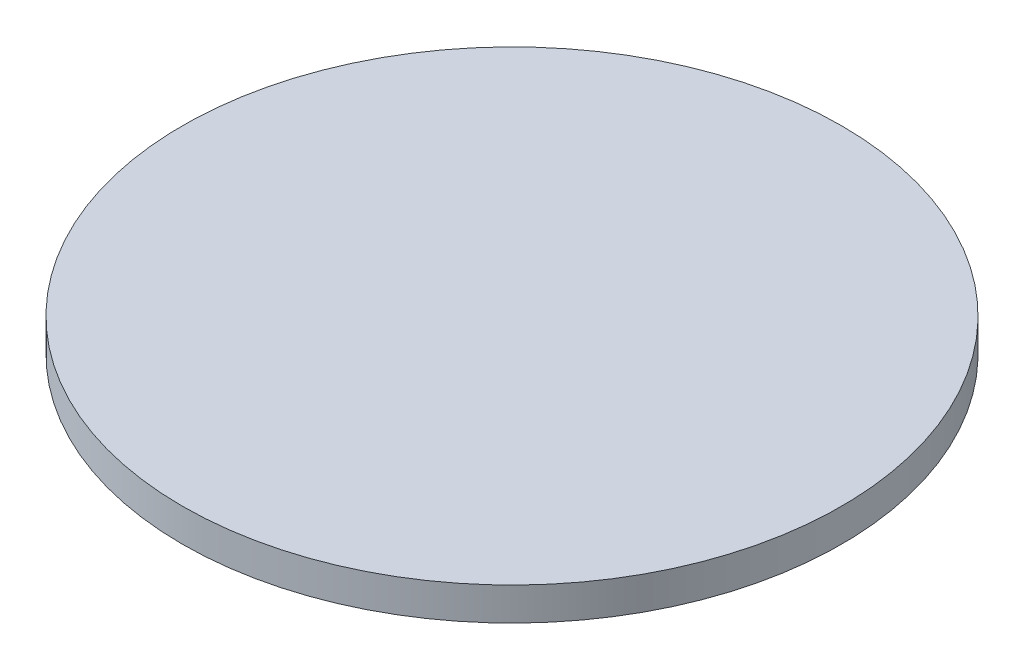
ISO-10303-21;
HEADER;
FILE_DESCRIPTION(('STEP AP214'),'2;1');
FILE_NAME('part.step','',(''),(''),'','','');
FILE_SCHEMA(('AUTOMOTIVE_DESIGN { 1 0 10303 214 1 1 1 1 }'));
ENDSEC;
DATA;
#1=APPLICATION_CONTEXT('core data for automotive mechanical design processes');
#2=APPLICATION_PROTOCOL_DEFINITION('international standard','automotive_design',2000,#1);
#3=PRODUCT_CONTEXT('',#1,'mechanical');
#4=PRODUCT('Part','Part','',(#3));
#5=PRODUCT_RELATED_PRODUCT_CATEGORY('part','',(#4));
#6=PRODUCT_DEFINITION_FORMATION('','',#4);
#7=PRODUCT_DEFINITION_CONTEXT('part definition',#1,'design');
#8=PRODUCT_DEFINITION('design','',#6,#7);
#9=PRODUCT_DEFINITION_SHAPE('','',#8);
#10=(LENGTH_UNIT() NAMED_UNIT(*) SI_UNIT(.MILLI.,.METRE.));
#11=(NAMED_UNIT(*) PLANE_ANGLE_UNIT() SI_UNIT($,.RADIAN.));
#12=(NAMED_UNIT(*) SI_UNIT($,.STERADIAN.) SOLID_ANGLE_UNIT());
#13=UNCERTAINTY_MEASURE_WITH_UNIT(LENGTH_MEASURE(1.E-05),#10,'distance_accuracy_value','');
#14=(GEOMETRIC_REPRESENTATION_CONTEXT(3) GLOBAL_UNCERTAINTY_ASSIGNED_CONTEXT((#13)) GLOBAL_UNIT_ASSIGNED_CONTEXT((#10,
#11,#12)) REPRESENTATION_CONTEXT('',''));
#15=CARTESIAN_POINT('',(0.,0.,0.));
#16=DIRECTION('',(0.,0.,1.));
#17=DIRECTION('',(1.,0.,0.));
#18=AXIS2_PLACEMENT_3D('',#15,#16,#17);
#19=CARTESIAN_POINT('',(0.,0.5,0.));
#20=DIRECTION('',(0.,-1.,0.));
#21=DIRECTION('',(0.,0.,-1.));
#22=AXIS2_PLACEMENT_3D('',#19,#20,#21);
#23=CYLINDRICAL_SURFACE('',#22,5.);
#24=CARTESIAN_POINT('',(0.,0.5,0.));
#25=DIRECTION('',(0.,1.,0.));
#26=DIRECTION('',(0.,0.,1.));
#27=AXIS2_PLACEMENT_3D('',#24,#25,#26);
#28=CIRCLE('',#27,5.);
#29=CARTESIAN_POINT('',(0.,0.5,5.));
#30=VERTEX_POINT('',#29);
#31=EDGE_CURVE('E10',#30,#30,#28,.T.);
#32=ORIENTED_EDGE('',*,*,#31,.F.);
#33=EDGE_LOOP('',(#32));
#34=FACE_BOUND('',#33,.T.);
#35=CARTESIAN_POINT('',(0.,0.,0.));
#36=DIRECTION('',(0.,1.,0.));
#37=DIRECTION('',(0.,0.,1.));
#38=AXIS2_PLACEMENT_3D('',#35,#36,#37);
#39=CIRCLE('',#38,5.);
#40=CARTESIAN_POINT('',(0.,0.,5.));
#41=VERTEX_POINT('',#40);
#42=EDGE_CURVE('E38',#41,#41,#39,.T.);
#43=ORIENTED_EDGE('',*,*,#42,.T.);
#44=EDGE_LOOP('',(#43));
#45=FACE_BOUND('',#44,.T.);
#46=ADVANCED_FACE('F35',(#34,#45),#23,.T.);
#47=CARTESIAN_POINT('',(0.,0.5,0.));
#48=DIRECTION('',(0.,1.,0.));
#49=DIRECTION('',(0.,0.,1.));
#50=AXIS2_PLACEMENT_3D('',#47,#48,#49);
#51=PLANE('',#50);
#52=ORIENTED_EDGE('',*,*,#31,.T.);
#53=EDGE_LOOP('',(#52));
#54=FACE_BOUND('',#53,.T.);
#55=ADVANCED_FACE('F50',(#54),#51,.T.);
#56=CARTESIAN_POINT('',(0.,0.,0.));
#57=DIRECTION('',(0.,1.,0.));
#58=DIRECTION('',(0.,0.,1.));
#59=AXIS2_PLACEMENT_3D('',#56,#57,#58);
#60=PLANE('',#59);
#61=ORIENTED_EDGE('',*,*,#42,.F.);
#62=EDGE_LOOP('',(#61));
#63=FACE_BOUND('',#62,.T.);
#64=ADVANCED_FACE('F48',(#63),#60,.F.);
#65=CLOSED_SHELL('',(#46,#55,#64));
#66=MANIFOLD_SOLID_BREP('B2',#65);
#67=ADVANCED_BREP_SHAPE_REPRESENTATION('',(#18,#66),#14);
#68=SHAPE_DEFINITION_REPRESENTATION(#9,#67);
ENDSEC;
END-ISO-10303-21;
